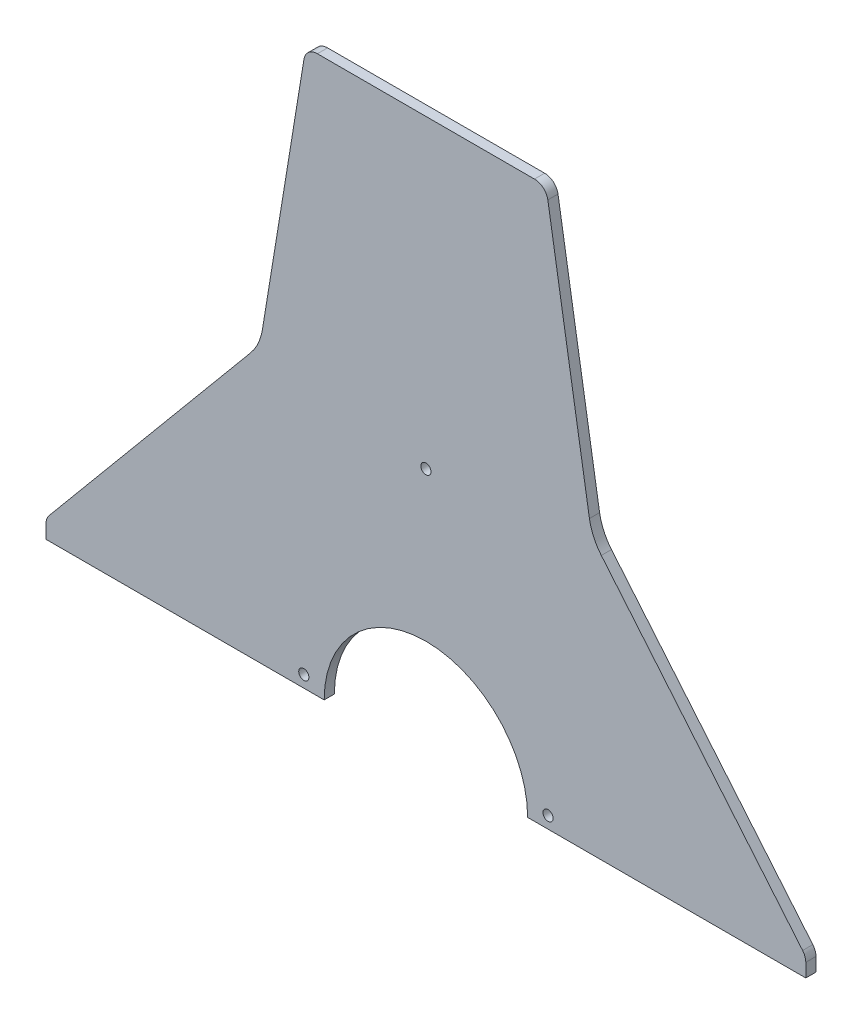
ISO-10303-21;
HEADER;
FILE_DESCRIPTION(('STEP AP214'),'2;1');
FILE_NAME('part.step','',(''),(''),'','','');
FILE_SCHEMA(('AUTOMOTIVE_DESIGN { 1 0 10303 214 1 1 1 1 }'));
ENDSEC;
DATA;
#1=APPLICATION_CONTEXT('core data for automotive mechanical design processes');
#2=APPLICATION_PROTOCOL_DEFINITION('international standard','automotive_design',2000,#1);
#3=PRODUCT_CONTEXT('',#1,'mechanical');
#4=PRODUCT('Part','Part','',(#3));
#5=PRODUCT_RELATED_PRODUCT_CATEGORY('part','',(#4));
#6=PRODUCT_DEFINITION_FORMATION('','',#4);
#7=PRODUCT_DEFINITION_CONTEXT('part definition',#1,'design');
#8=PRODUCT_DEFINITION('design','',#6,#7);
#9=PRODUCT_DEFINITION_SHAPE('','',#8);
#10=(LENGTH_UNIT() NAMED_UNIT(*) SI_UNIT(.MILLI.,.METRE.));
#11=(NAMED_UNIT(*) PLANE_ANGLE_UNIT() SI_UNIT($,.RADIAN.));
#12=(NAMED_UNIT(*) SI_UNIT($,.STERADIAN.) SOLID_ANGLE_UNIT());
#13=UNCERTAINTY_MEASURE_WITH_UNIT(LENGTH_MEASURE(1.E-05),#10,'distance_accuracy_value','');
#14=(GEOMETRIC_REPRESENTATION_CONTEXT(3) GLOBAL_UNCERTAINTY_ASSIGNED_CONTEXT((#13)) GLOBAL_UNIT_ASSIGNED_CONTEXT((#10,
#11,#12)) REPRESENTATION_CONTEXT('',''));
#15=CARTESIAN_POINT('',(0.,0.,0.));
#16=DIRECTION('',(0.,0.,1.));
#17=DIRECTION('',(1.,0.,0.));
#18=AXIS2_PLACEMENT_3D('',#15,#16,#17);
#19=CARTESIAN_POINT('',(355.6,139.7,139.7));
#20=DIRECTION('',(0.,1.,0.));
#21=DIRECTION('',(0.,0.,1.));
#22=AXIS2_PLACEMENT_3D('',#19,#20,#21);
#23=PLANE('',#22);
#24=DIRECTION('',(1.,0.,0.));
#25=VECTOR('',#24,1.);
#26=CARTESIAN_POINT('',(355.6,139.7,130.175));
#27=LINE('',#26,#25);
#28=CARTESIAN_POINT('',(95.25,139.7,130.175));
#29=VERTEX_POINT('',#28);
#30=CARTESIAN_POINT('',(355.6,139.7,130.175));
#31=VERTEX_POINT('',#30);
#32=EDGE_CURVE('E148',#29,#31,#27,.T.);
#33=ORIENTED_EDGE('',*,*,#32,.T.);
#34=DIRECTION('',(0.,0.,-1.));
#35=VECTOR('',#34,1.);
#36=CARTESIAN_POINT('',(355.6,139.7,139.7));
#37=LINE('',#36,#35);
#38=CARTESIAN_POINT('',(355.6,139.7,139.7));
#39=VERTEX_POINT('',#38);
#40=EDGE_CURVE('E11',#39,#31,#37,.T.);
#41=ORIENTED_EDGE('',*,*,#40,.F.);
#42=DIRECTION('',(1.,0.,0.));
#43=VECTOR('',#42,1.);
#44=CARTESIAN_POINT('',(355.6,139.7,139.7));
#45=LINE('',#44,#43);
#46=CARTESIAN_POINT('',(95.25,139.7,139.7));
#47=VERTEX_POINT('',#46);
#48=EDGE_CURVE('E196',#47,#39,#45,.T.);
#49=ORIENTED_EDGE('',*,*,#48,.F.);
#50=DIRECTION('',(0.,0.,-1.));
#51=VECTOR('',#50,1.);
#52=CARTESIAN_POINT('',(95.25,139.7,139.7));
#53=LINE('',#52,#51);
#54=EDGE_CURVE('E161',#47,#29,#53,.T.);
#55=ORIENTED_EDGE('',*,*,#54,.T.);
#56=EDGE_LOOP('',(#33,#41,#49,#55));
#57=FACE_BOUND('',#56,.T.);
#58=ADVANCED_FACE('F32',(#57),#23,.F.);
#59=CARTESIAN_POINT('',(355.6,152.4,139.7));
#60=DIRECTION('',(-1.,0.,0.));
#61=DIRECTION('',(0.,0.,1.));
#62=AXIS2_PLACEMENT_3D('',#59,#60,#61);
#63=PLANE('',#62);
#64=DIRECTION('',(0.,1.,0.));
#65=VECTOR('',#64,1.);
#66=CARTESIAN_POINT('',(355.6,152.4,130.175));
#67=LINE('',#66,#65);
#68=CARTESIAN_POINT('',(355.6,152.4,130.175));
#69=VERTEX_POINT('',#68);
#70=EDGE_CURVE('E144',#31,#69,#67,.T.);
#71=ORIENTED_EDGE('',*,*,#70,.T.);
#72=DIRECTION('',(0.,0.,-1.));
#73=VECTOR('',#72,1.);
#74=CARTESIAN_POINT('',(355.6,152.4,139.7));
#75=LINE('',#74,#73);
#76=CARTESIAN_POINT('',(355.6,152.4,139.7));
#77=VERTEX_POINT('',#76);
#78=EDGE_CURVE('E39',#77,#69,#75,.T.);
#79=ORIENTED_EDGE('',*,*,#78,.F.);
#80=DIRECTION('',(0.,1.,0.));
#81=VECTOR('',#80,1.);
#82=CARTESIAN_POINT('',(355.6,152.4,139.7));
#83=LINE('',#82,#81);
#84=EDGE_CURVE('E157',#39,#77,#83,.T.);
#85=ORIENTED_EDGE('',*,*,#84,.F.);
#86=ORIENTED_EDGE('',*,*,#40,.T.);
#87=EDGE_LOOP('',(#71,#79,#85,#86));
#88=FACE_BOUND('',#87,.T.);
#89=ADVANCED_FACE('F156',(#88),#63,.F.);
#90=CARTESIAN_POINT('',(342.9,152.4,139.7));
#91=DIRECTION('',(0.,0.,-1.));
#92=DIRECTION('',(-1.,0.,0.));
#93=AXIS2_PLACEMENT_3D('',#90,#91,#92);
#94=CYLINDRICAL_SURFACE('',#93,12.7);
#95=CARTESIAN_POINT('',(342.9,152.4,130.175));
#96=DIRECTION('',(0.,0.,1.));
#97=DIRECTION('',(1.,0.,0.));
#98=AXIS2_PLACEMENT_3D('',#95,#96,#97);
#99=CIRCLE('',#98,12.7);
#100=CARTESIAN_POINT('',(352.654107762785,160.533104066221,130.175));
#101=VERTEX_POINT('',#100);
#102=EDGE_CURVE('E150',#69,#101,#99,.T.);
#103=ORIENTED_EDGE('',*,*,#102,.T.);
#104=DIRECTION('',(0.,0.,-1.));
#105=VECTOR('',#104,1.);
#106=CARTESIAN_POINT('',(352.654107762785,160.533104066221,139.7));
#107=LINE('',#106,#105);
#108=CARTESIAN_POINT('',(352.654107762785,160.533104066221,139.7));
#109=VERTEX_POINT('',#108);
#110=EDGE_CURVE('E262',#109,#101,#107,.T.);
#111=ORIENTED_EDGE('',*,*,#110,.F.);
#112=CARTESIAN_POINT('',(342.9,152.4,139.7));
#113=DIRECTION('',(0.,0.,1.));
#114=DIRECTION('',(1.,0.,0.));
#115=AXIS2_PLACEMENT_3D('',#112,#113,#114);
#116=CIRCLE('',#115,12.7);
#117=EDGE_CURVE('E199',#77,#109,#116,.T.);
#118=ORIENTED_EDGE('',*,*,#117,.F.);
#119=ORIENTED_EDGE('',*,*,#78,.T.);
#120=EDGE_LOOP('',(#103,#111,#118,#119));
#121=FACE_BOUND('',#120,.T.);
#122=ADVANCED_FACE('F266',(#121),#94,.T.);
#123=CARTESIAN_POINT('',(164.18356894886,386.567583735117,139.7));
#124=DIRECTION('',(-0.768039981321658,-0.640401894978011,0.));
#125=DIRECTION('',(0.640401894978011,-0.768039981321658,0.));
#126=AXIS2_PLACEMENT_3D('',#123,#124,#125);
#127=PLANE('',#126);
#128=DIRECTION('',(-0.640401894978011,0.768039981321658,0.));
#129=VECTOR('',#128,1.);
#130=CARTESIAN_POINT('',(164.18356894886,386.567583735117,130.175));
#131=LINE('',#130,#129);
#132=CARTESIAN_POINT('',(164.18356894886,386.567583735117,130.175));
#133=VERTEX_POINT('',#132);
#134=EDGE_CURVE('E170',#101,#133,#131,.T.);
#135=ORIENTED_EDGE('',*,*,#134,.T.);
#136=DIRECTION('',(0.,0.,-1.));
#137=VECTOR('',#136,1.);
#138=CARTESIAN_POINT('',(164.18356894886,386.567583735117,139.7));
#139=LINE('',#138,#137);
#140=CARTESIAN_POINT('',(164.18356894886,386.567583735117,139.7));
#141=VERTEX_POINT('',#140);
#142=EDGE_CURVE('E259',#141,#133,#139,.T.);
#143=ORIENTED_EDGE('',*,*,#142,.F.);
#144=DIRECTION('',(-0.640401894978011,0.768039981321658,0.));
#145=VECTOR('',#144,1.);
#146=CARTESIAN_POINT('',(164.18356894886,386.567583735117,139.7));
#147=LINE('',#146,#145);
#148=EDGE_CURVE('E201',#109,#141,#147,.T.);
#149=ORIENTED_EDGE('',*,*,#148,.F.);
#150=ORIENTED_EDGE('',*,*,#110,.T.);
#151=EDGE_LOOP('',(#135,#143,#149,#150));
#152=FACE_BOUND('',#151,.T.);
#153=ADVANCED_FACE('F274',(#152),#127,.F.);
#154=CARTESIAN_POINT('',(203.2,419.1,139.7));
#155=DIRECTION('',(0.,0.,-1.));
#156=DIRECTION('',(-1.,0.,0.));
#157=AXIS2_PLACEMENT_3D('',#154,#155,#156);
#158=CYLINDRICAL_SURFACE('',#157,50.8);
#159=CARTESIAN_POINT('',(203.2,419.1,130.175));
#160=DIRECTION('',(0.,0.,-1.));
#161=DIRECTION('',(1.,0.,0.));
#162=AXIS2_PLACEMENT_3D('',#159,#160,#161);
#163=CIRCLE('',#162,50.8);
#164=CARTESIAN_POINT('',(153.061701435952,410.927422860423,130.175));
#165=VERTEX_POINT('',#164);
#166=EDGE_CURVE('E172',#133,#165,#163,.T.);
#167=ORIENTED_EDGE('',*,*,#166,.T.);
#168=DIRECTION('',(0.,0.,-1.));
#169=VECTOR('',#168,1.);
#170=CARTESIAN_POINT('',(153.061701435952,410.927422860423,139.7));
#171=LINE('',#170,#169);
#172=CARTESIAN_POINT('',(153.061701435952,410.927422860423,139.7));
#173=VERTEX_POINT('',#172);
#174=EDGE_CURVE('E256',#173,#165,#171,.T.);
#175=ORIENTED_EDGE('',*,*,#174,.F.);
#176=CARTESIAN_POINT('',(203.2,419.1,139.7));
#177=DIRECTION('',(0.,0.,-1.));
#178=DIRECTION('',(1.,0.,0.));
#179=AXIS2_PLACEMENT_3D('',#176,#177,#178);
#180=CIRCLE('',#179,50.8);
#181=EDGE_CURVE('E203',#141,#173,#180,.T.);
#182=ORIENTED_EDGE('',*,*,#181,.F.);
#183=ORIENTED_EDGE('',*,*,#142,.T.);
#184=EDGE_LOOP('',(#167,#175,#182,#183));
#185=FACE_BOUND('',#184,.T.);
#186=ADVANCED_FACE('F277',(#185),#158,.F.);
#187=CARTESIAN_POINT('',(114.134574641012,649.743144284894,139.7));
#188=DIRECTION('',(-0.986974381182056,-0.16087750274758,0.));
#189=DIRECTION('',(0.16087750274758,-0.986974381182056,0.));
#190=AXIS2_PLACEMENT_3D('',#187,#188,#189);
#191=PLANE('',#190);
#192=DIRECTION('',(-0.16087750274758,0.986974381182056,0.));
#193=VECTOR('',#192,1.);
#194=CARTESIAN_POINT('',(114.134574641012,649.743144284894,130.175));
#195=LINE('',#194,#193);
#196=CARTESIAN_POINT('',(114.134574641012,649.743144284894,130.175));
#197=VERTEX_POINT('',#196);
#198=EDGE_CURVE('E174',#165,#197,#195,.T.);
#199=ORIENTED_EDGE('',*,*,#198,.T.);
#200=DIRECTION('',(0.,0.,-1.));
#201=VECTOR('',#200,1.);
#202=CARTESIAN_POINT('',(114.134574641012,649.743144284894,139.7));
#203=LINE('',#202,#201);
#204=CARTESIAN_POINT('',(114.134574641012,649.743144284894,139.7));
#205=VERTEX_POINT('',#204);
#206=EDGE_CURVE('E253',#205,#197,#203,.T.);
#207=ORIENTED_EDGE('',*,*,#206,.F.);
#208=DIRECTION('',(-0.16087750274758,0.986974381182056,0.));
#209=VECTOR('',#208,1.);
#210=CARTESIAN_POINT('',(114.134574641012,649.743144284894,139.7));
#211=LINE('',#210,#209);
#212=EDGE_CURVE('E205',#173,#205,#211,.T.);
#213=ORIENTED_EDGE('',*,*,#212,.F.);
#214=ORIENTED_EDGE('',*,*,#174,.T.);
#215=EDGE_LOOP('',(#199,#207,#213,#214));
#216=FACE_BOUND('',#215,.T.);
#217=ADVANCED_FACE('F282',(#216),#191,.F.);
#218=CARTESIAN_POINT('',(101.6,647.7,139.7));
#219=DIRECTION('',(0.,0.,-1.));
#220=DIRECTION('',(-1.,0.,0.));
#221=AXIS2_PLACEMENT_3D('',#218,#219,#220);
#222=CYLINDRICAL_SURFACE('',#221,12.7);
#223=CARTESIAN_POINT('',(101.6,647.7,130.175));
#224=DIRECTION('',(0.,0.,1.));
#225=DIRECTION('',(-1.,0.,0.));
#226=AXIS2_PLACEMENT_3D('',#223,#224,#225);
#227=CIRCLE('',#226,12.7);
#228=CARTESIAN_POINT('',(101.6,660.4,130.175));
#229=VERTEX_POINT('',#228);
#230=EDGE_CURVE('E176',#197,#229,#227,.T.);
#231=ORIENTED_EDGE('',*,*,#230,.T.);
#232=DIRECTION('',(0.,0.,-1.));
#233=VECTOR('',#232,1.);
#234=CARTESIAN_POINT('',(101.6,660.4,139.7));
#235=LINE('',#234,#233);
#236=CARTESIAN_POINT('',(101.6,660.4,139.7));
#237=VERTEX_POINT('',#236);
#238=EDGE_CURVE('E250',#237,#229,#235,.T.);
#239=ORIENTED_EDGE('',*,*,#238,.F.);
#240=CARTESIAN_POINT('',(101.6,647.7,139.7));
#241=DIRECTION('',(0.,0.,1.));
#242=DIRECTION('',(-1.,0.,0.));
#243=AXIS2_PLACEMENT_3D('',#240,#241,#242);
#244=CIRCLE('',#243,12.7);
#245=EDGE_CURVE('E207',#205,#237,#244,.T.);
#246=ORIENTED_EDGE('',*,*,#245,.F.);
#247=ORIENTED_EDGE('',*,*,#206,.T.);
#248=EDGE_LOOP('',(#231,#239,#246,#247));
#249=FACE_BOUND('',#248,.T.);
#250=ADVANCED_FACE('F288',(#249),#222,.T.);
#251=CARTESIAN_POINT('',(101.6,660.4,139.7));
#252=DIRECTION('',(0.,-1.,0.));
#253=DIRECTION('',(0.,0.,-1.));
#254=AXIS2_PLACEMENT_3D('',#251,#252,#253);
#255=PLANE('',#254);
#256=DIRECTION('',(-1.,0.,0.));
#257=VECTOR('',#256,1.);
#258=CARTESIAN_POINT('',(101.6,660.4,130.175));
#259=LINE('',#258,#257);
#260=CARTESIAN_POINT('',(-101.6,660.4,130.175));
#261=VERTEX_POINT('',#260);
#262=EDGE_CURVE('E178',#229,#261,#259,.T.);
#263=ORIENTED_EDGE('',*,*,#262,.T.);
#264=DIRECTION('',(0.,0.,-1.));
#265=VECTOR('',#264,1.);
#266=CARTESIAN_POINT('',(-101.6,660.4,139.7));
#267=LINE('',#266,#265);
#268=CARTESIAN_POINT('',(-101.6,660.4,139.7));
#269=VERTEX_POINT('',#268);
#270=EDGE_CURVE('E247',#269,#261,#267,.T.);
#271=ORIENTED_EDGE('',*,*,#270,.F.);
#272=DIRECTION('',(-1.,0.,0.));
#273=VECTOR('',#272,1.);
#274=CARTESIAN_POINT('',(101.6,660.4,139.7));
#275=LINE('',#274,#273);
#276=EDGE_CURVE('E209',#237,#269,#275,.T.);
#277=ORIENTED_EDGE('',*,*,#276,.F.);
#278=ORIENTED_EDGE('',*,*,#238,.T.);
#279=EDGE_LOOP('',(#263,#271,#277,#278));
#280=FACE_BOUND('',#279,.T.);
#281=ADVANCED_FACE('F292',(#280),#255,.F.);
#282=CARTESIAN_POINT('',(-101.6,647.7,139.7));
#283=DIRECTION('',(0.,0.,-1.));
#284=DIRECTION('',(-1.,0.,0.));
#285=AXIS2_PLACEMENT_3D('',#282,#283,#284);
#286=CYLINDRICAL_SURFACE('',#285,12.7);
#287=CARTESIAN_POINT('',(-101.6,647.7,130.175));
#288=DIRECTION('',(0.,0.,1.));
#289=DIRECTION('',(-1.,0.,0.));
#290=AXIS2_PLACEMENT_3D('',#287,#288,#289);
#291=CIRCLE('',#290,12.7);
#292=CARTESIAN_POINT('',(-114.134574641012,649.743144284894,130.175));
#293=VERTEX_POINT('',#292);
#294=EDGE_CURVE('E180',#261,#293,#291,.T.);
#295=ORIENTED_EDGE('',*,*,#294,.T.);
#296=DIRECTION('',(0.,0.,-1.));
#297=VECTOR('',#296,1.);
#298=CARTESIAN_POINT('',(-114.134574641012,649.743144284894,139.7));
#299=LINE('',#298,#297);
#300=CARTESIAN_POINT('',(-114.134574641012,649.743144284894,139.7));
#301=VERTEX_POINT('',#300);
#302=EDGE_CURVE('E244',#301,#293,#299,.T.);
#303=ORIENTED_EDGE('',*,*,#302,.F.);
#304=CARTESIAN_POINT('',(-101.6,647.7,139.7));
#305=DIRECTION('',(0.,0.,1.));
#306=DIRECTION('',(-1.,0.,0.));
#307=AXIS2_PLACEMENT_3D('',#304,#305,#306);
#308=CIRCLE('',#307,12.7);
#309=EDGE_CURVE('E211',#269,#301,#308,.T.);
#310=ORIENTED_EDGE('',*,*,#309,.F.);
#311=ORIENTED_EDGE('',*,*,#270,.T.);
#312=EDGE_LOOP('',(#295,#303,#310,#311));
#313=FACE_BOUND('',#312,.T.);
#314=ADVANCED_FACE('F297',(#313),#286,.T.);
#315=CARTESIAN_POINT('',(-114.134574641012,649.743144284894,139.7));
#316=DIRECTION('',(0.986974381182056,-0.16087750274758,0.));
#317=DIRECTION('',(0.16087750274758,0.986974381182056,0.));
#318=AXIS2_PLACEMENT_3D('',#315,#316,#317);
#319=PLANE('',#318);
#320=DIRECTION('',(-0.16087750274758,-0.986974381182056,0.));
#321=VECTOR('',#320,1.);
#322=CARTESIAN_POINT('',(-114.134574641012,649.743144284894,130.175));
#323=LINE('',#322,#321);
#324=CARTESIAN_POINT('',(-153.061701435952,410.927422860423,130.175));
#325=VERTEX_POINT('',#324);
#326=EDGE_CURVE('E182',#293,#325,#323,.T.);
#327=ORIENTED_EDGE('',*,*,#326,.T.);
#328=DIRECTION('',(0.,0.,-1.));
#329=VECTOR('',#328,1.);
#330=CARTESIAN_POINT('',(-153.061701435952,410.927422860423,139.7));
#331=LINE('',#330,#329);
#332=CARTESIAN_POINT('',(-153.061701435952,410.927422860423,139.7));
#333=VERTEX_POINT('',#332);
#334=EDGE_CURVE('E241',#333,#325,#331,.T.);
#335=ORIENTED_EDGE('',*,*,#334,.F.);
#336=DIRECTION('',(-0.16087750274758,-0.986974381182056,0.));
#337=VECTOR('',#336,1.);
#338=CARTESIAN_POINT('',(-114.134574641012,649.743144284894,139.7));
#339=LINE('',#338,#337);
#340=EDGE_CURVE('E213',#301,#333,#339,.T.);
#341=ORIENTED_EDGE('',*,*,#340,.F.);
#342=ORIENTED_EDGE('',*,*,#302,.T.);
#343=EDGE_LOOP('',(#327,#335,#341,#342));
#344=FACE_BOUND('',#343,.T.);
#345=ADVANCED_FACE('F303',(#344),#319,.F.);
#346=CARTESIAN_POINT('',(-203.2,419.1,139.7));
#347=DIRECTION('',(0.,0.,-1.));
#348=DIRECTION('',(-1.,0.,0.));
#349=AXIS2_PLACEMENT_3D('',#346,#347,#348);
#350=CYLINDRICAL_SURFACE('',#349,50.8);
#351=CARTESIAN_POINT('',(-203.2,419.1,130.175));
#352=DIRECTION('',(0.,0.,-1.));
#353=DIRECTION('',(-1.,0.,0.));
#354=AXIS2_PLACEMENT_3D('',#351,#352,#353);
#355=CIRCLE('',#354,50.8);
#356=CARTESIAN_POINT('',(-164.18356894886,386.567583735117,130.175));
#357=VERTEX_POINT('',#356);
#358=EDGE_CURVE('E184',#325,#357,#355,.T.);
#359=ORIENTED_EDGE('',*,*,#358,.T.);
#360=DIRECTION('',(0.,0.,-1.));
#361=VECTOR('',#360,1.);
#362=CARTESIAN_POINT('',(-164.18356894886,386.567583735117,139.7));
#363=LINE('',#362,#361);
#364=CARTESIAN_POINT('',(-164.18356894886,386.567583735117,139.7));
#365=VERTEX_POINT('',#364);
#366=EDGE_CURVE('E238',#365,#357,#363,.T.);
#367=ORIENTED_EDGE('',*,*,#366,.F.);
#368=CARTESIAN_POINT('',(-203.2,419.1,139.7));
#369=DIRECTION('',(0.,0.,-1.));
#370=DIRECTION('',(-1.,0.,0.));
#371=AXIS2_PLACEMENT_3D('',#368,#369,#370);
#372=CIRCLE('',#371,50.8);
#373=EDGE_CURVE('E215',#333,#365,#372,.T.);
#374=ORIENTED_EDGE('',*,*,#373,.F.);
#375=ORIENTED_EDGE('',*,*,#334,.T.);
#376=EDGE_LOOP('',(#359,#367,#374,#375));
#377=FACE_BOUND('',#376,.T.);
#378=ADVANCED_FACE('F307',(#377),#350,.F.);
#379=CARTESIAN_POINT('',(-164.18356894886,386.567583735117,139.7));
#380=DIRECTION('',(0.768039981321658,-0.640401894978011,0.));
#381=DIRECTION('',(0.640401894978011,0.768039981321658,0.));
#382=AXIS2_PLACEMENT_3D('',#379,#380,#381);
#383=PLANE('',#382);
#384=DIRECTION('',(-0.640401894978011,-0.768039981321658,0.));
#385=VECTOR('',#384,1.);
#386=CARTESIAN_POINT('',(-164.18356894886,386.567583735117,130.175));
#387=LINE('',#386,#385);
#388=CARTESIAN_POINT('',(-352.654107762785,160.533104066221,130.175));
#389=VERTEX_POINT('',#388);
#390=EDGE_CURVE('E186',#357,#389,#387,.T.);
#391=ORIENTED_EDGE('',*,*,#390,.T.);
#392=DIRECTION('',(0.,0.,-1.));
#393=VECTOR('',#392,1.);
#394=CARTESIAN_POINT('',(-352.654107762785,160.533104066221,139.7));
#395=LINE('',#394,#393);
#396=CARTESIAN_POINT('',(-352.654107762785,160.533104066221,139.7));
#397=VERTEX_POINT('',#396);
#398=EDGE_CURVE('E235',#397,#389,#395,.T.);
#399=ORIENTED_EDGE('',*,*,#398,.F.);
#400=DIRECTION('',(-0.640401894978011,-0.768039981321658,0.));
#401=VECTOR('',#400,1.);
#402=CARTESIAN_POINT('',(-164.18356894886,386.567583735117,139.7));
#403=LINE('',#402,#401);
#404=EDGE_CURVE('E217',#365,#397,#403,.T.);
#405=ORIENTED_EDGE('',*,*,#404,.F.);
#406=ORIENTED_EDGE('',*,*,#366,.T.);
#407=EDGE_LOOP('',(#391,#399,#405,#406));
#408=FACE_BOUND('',#407,.T.);
#409=ADVANCED_FACE('F312',(#408),#383,.F.);
#410=CARTESIAN_POINT('',(-342.9,152.4,139.7));
#411=DIRECTION('',(0.,0.,-1.));
#412=DIRECTION('',(-1.,0.,0.));
#413=AXIS2_PLACEMENT_3D('',#410,#411,#412);
#414=CYLINDRICAL_SURFACE('',#413,12.7);
#415=CARTESIAN_POINT('',(-342.9,152.4,130.175));
#416=DIRECTION('',(0.,0.,1.));
#417=DIRECTION('',(-1.,0.,0.));
#418=AXIS2_PLACEMENT_3D('',#415,#416,#417);
#419=CIRCLE('',#418,12.7);
#420=CARTESIAN_POINT('',(-355.6,152.4,130.175));
#421=VERTEX_POINT('',#420);
#422=EDGE_CURVE('E188',#389,#421,#419,.T.);
#423=ORIENTED_EDGE('',*,*,#422,.T.);
#424=DIRECTION('',(0.,0.,-1.));
#425=VECTOR('',#424,1.);
#426=CARTESIAN_POINT('',(-355.6,152.4,139.7));
#427=LINE('',#426,#425);
#428=CARTESIAN_POINT('',(-355.6,152.4,139.7));
#429=VERTEX_POINT('',#428);
#430=EDGE_CURVE('E232',#429,#421,#427,.T.);
#431=ORIENTED_EDGE('',*,*,#430,.F.);
#432=CARTESIAN_POINT('',(-342.9,152.4,139.7));
#433=DIRECTION('',(0.,0.,1.));
#434=DIRECTION('',(-1.,0.,0.));
#435=AXIS2_PLACEMENT_3D('',#432,#433,#434);
#436=CIRCLE('',#435,12.7);
#437=EDGE_CURVE('E219',#397,#429,#436,.T.);
#438=ORIENTED_EDGE('',*,*,#437,.F.);
#439=ORIENTED_EDGE('',*,*,#398,.T.);
#440=EDGE_LOOP('',(#423,#431,#438,#439));
#441=FACE_BOUND('',#440,.T.);
#442=ADVANCED_FACE('F318',(#441),#414,.T.);
#443=CARTESIAN_POINT('',(-355.6,152.4,139.7));
#444=DIRECTION('',(1.,0.,0.));
#445=DIRECTION('',(0.,0.,-1.));
#446=AXIS2_PLACEMENT_3D('',#443,#444,#445);
#447=PLANE('',#446);
#448=DIRECTION('',(0.,-1.,0.));
#449=VECTOR('',#448,1.);
#450=CARTESIAN_POINT('',(-355.6,152.4,130.175));
#451=LINE('',#450,#449);
#452=CARTESIAN_POINT('',(-355.6,139.7,130.175));
#453=VERTEX_POINT('',#452);
#454=EDGE_CURVE('E190',#421,#453,#451,.T.);
#455=ORIENTED_EDGE('',*,*,#454,.T.);
#456=DIRECTION('',(0.,0.,-1.));
#457=VECTOR('',#456,1.);
#458=CARTESIAN_POINT('',(-355.6,139.7,139.7));
#459=LINE('',#458,#457);
#460=CARTESIAN_POINT('',(-355.6,139.7,139.7));
#461=VERTEX_POINT('',#460);
#462=EDGE_CURVE('E229',#461,#453,#459,.T.);
#463=ORIENTED_EDGE('',*,*,#462,.F.);
#464=DIRECTION('',(0.,-1.,0.));
#465=VECTOR('',#464,1.);
#466=CARTESIAN_POINT('',(-355.6,152.4,139.7));
#467=LINE('',#466,#465);
#468=EDGE_CURVE('E221',#429,#461,#467,.T.);
#469=ORIENTED_EDGE('',*,*,#468,.F.);
#470=ORIENTED_EDGE('',*,*,#430,.T.);
#471=EDGE_LOOP('',(#455,#463,#469,#470));
#472=FACE_BOUND('',#471,.T.);
#473=ADVANCED_FACE('F322',(#472),#447,.F.);
#474=CARTESIAN_POINT('',(-95.25,139.7,139.7));
#475=DIRECTION('',(0.,1.,0.));
#476=DIRECTION('',(-1.,0.,0.));
#477=AXIS2_PLACEMENT_3D('',#474,#475,#476);
#478=PLANE('',#477);
#479=DIRECTION('',(1.,0.,0.));
#480=VECTOR('',#479,1.);
#481=CARTESIAN_POINT('',(-95.25,139.7,130.175));
#482=LINE('',#481,#480);
#483=CARTESIAN_POINT('',(-95.25,139.7,130.175));
#484=VERTEX_POINT('',#483);
#485=EDGE_CURVE('E192',#453,#484,#482,.T.);
#486=ORIENTED_EDGE('',*,*,#485,.T.);
#487=DIRECTION('',(0.,0.,-1.));
#488=VECTOR('',#487,1.);
#489=CARTESIAN_POINT('',(-95.25,139.7,139.7));
#490=LINE('',#489,#488);
#491=CARTESIAN_POINT('',(-95.25,139.7,139.7));
#492=VERTEX_POINT('',#491);
#493=EDGE_CURVE('E226',#492,#484,#490,.T.);
#494=ORIENTED_EDGE('',*,*,#493,.F.);
#495=DIRECTION('',(1.,0.,0.));
#496=VECTOR('',#495,1.);
#497=CARTESIAN_POINT('',(-95.25,139.7,139.7));
#498=LINE('',#497,#496);
#499=EDGE_CURVE('E51',#461,#492,#498,.T.);
#500=ORIENTED_EDGE('',*,*,#499,.F.);
#501=ORIENTED_EDGE('',*,*,#462,.T.);
#502=EDGE_LOOP('',(#486,#494,#500,#501));
#503=FACE_BOUND('',#502,.T.);
#504=ADVANCED_FACE('F325',(#503),#478,.F.);
#505=CARTESIAN_POINT('',(0.,139.7,139.7));
#506=DIRECTION('',(0.,0.,-1.));
#507=DIRECTION('',(-1.,0.,0.));
#508=AXIS2_PLACEMENT_3D('',#505,#506,#507);
#509=CYLINDRICAL_SURFACE('',#508,95.25);
#510=CARTESIAN_POINT('',(0.,139.7,130.175));
#511=DIRECTION('',(0.,0.,-1.));
#512=DIRECTION('',(1.,0.,0.));
#513=AXIS2_PLACEMENT_3D('',#510,#511,#512);
#514=CIRCLE('',#513,95.25);
#515=EDGE_CURVE('E194',#484,#29,#514,.T.);
#516=ORIENTED_EDGE('',*,*,#515,.T.);
#517=ORIENTED_EDGE('',*,*,#54,.F.);
#518=CARTESIAN_POINT('',(0.,139.7,139.7));
#519=DIRECTION('',(0.,0.,-1.));
#520=DIRECTION('',(1.,0.,0.));
#521=AXIS2_PLACEMENT_3D('',#518,#519,#520);
#522=CIRCLE('',#521,95.25);
#523=EDGE_CURVE('E46',#492,#47,#522,.T.);
#524=ORIENTED_EDGE('',*,*,#523,.F.);
#525=ORIENTED_EDGE('',*,*,#493,.T.);
#526=EDGE_LOOP('',(#516,#517,#524,#525));
#527=FACE_BOUND('',#526,.T.);
#528=ADVANCED_FACE('F327',(#527),#509,.F.);
#529=CARTESIAN_POINT('',(0.,139.7,139.7));
#530=DIRECTION('',(0.,0.,1.));
#531=DIRECTION('',(1.,0.,0.));
#532=AXIS2_PLACEMENT_3D('',#529,#530,#531);
#533=PLANE('',#532);
#534=CARTESIAN_POINT('',(-114.3,150.8252,139.7));
#535=DIRECTION('',(0.,0.,1.));
#536=DIRECTION('',(-1.,0.,0.));
#537=AXIS2_PLACEMENT_3D('',#534,#535,#536);
#538=CIRCLE('',#537,4.7625);
#539=CARTESIAN_POINT('',(-119.0625,150.8252,139.7));
#540=VERTEX_POINT('',#539);
#541=EDGE_CURVE('E434',#540,#540,#538,.T.);
#542=ORIENTED_EDGE('',*,*,#541,.F.);
#543=EDGE_LOOP('',(#542));
#544=FACE_BOUND('',#543,.T.);
#545=CARTESIAN_POINT('',(114.3,150.8252,139.7));
#546=DIRECTION('',(0.,0.,1.));
#547=DIRECTION('',(1.,0.,0.));
#548=AXIS2_PLACEMENT_3D('',#545,#546,#547);
#549=CIRCLE('',#548,4.7625);
#550=CARTESIAN_POINT('',(119.0625,150.8252,139.7));
#551=VERTEX_POINT('',#550);
#552=EDGE_CURVE('E436',#551,#551,#549,.T.);
#553=ORIENTED_EDGE('',*,*,#552,.F.);
#554=EDGE_LOOP('',(#553));
#555=FACE_BOUND('',#554,.T.);
#556=CARTESIAN_POINT('',(0.,374.65,139.7));
#557=DIRECTION('',(0.,0.,1.));
#558=DIRECTION('',(1.,0.,0.));
#559=AXIS2_PLACEMENT_3D('',#556,#557,#558);
#560=CIRCLE('',#559,4.7625);
#561=CARTESIAN_POINT('',(4.7625,374.65,139.7));
#562=VERTEX_POINT('',#561);
#563=EDGE_CURVE('E165',#562,#562,#560,.T.);
#564=ORIENTED_EDGE('',*,*,#563,.F.);
#565=EDGE_LOOP('',(#564));
#566=FACE_BOUND('',#565,.T.);
#567=ORIENTED_EDGE('',*,*,#48,.T.);
#568=ORIENTED_EDGE('',*,*,#84,.T.);
#569=ORIENTED_EDGE('',*,*,#117,.T.);
#570=ORIENTED_EDGE('',*,*,#148,.T.);
#571=ORIENTED_EDGE('',*,*,#181,.T.);
#572=ORIENTED_EDGE('',*,*,#212,.T.);
#573=ORIENTED_EDGE('',*,*,#245,.T.);
#574=ORIENTED_EDGE('',*,*,#276,.T.);
#575=ORIENTED_EDGE('',*,*,#309,.T.);
#576=ORIENTED_EDGE('',*,*,#340,.T.);
#577=ORIENTED_EDGE('',*,*,#373,.T.);
#578=ORIENTED_EDGE('',*,*,#404,.T.);
#579=ORIENTED_EDGE('',*,*,#437,.T.);
#580=ORIENTED_EDGE('',*,*,#468,.T.);
#581=ORIENTED_EDGE('',*,*,#499,.T.);
#582=ORIENTED_EDGE('',*,*,#523,.T.);
#583=EDGE_LOOP('',(#567,#568,#569,#570,#571,#572,#573,#574,#575,#576,#577,#578,#579,#580,#581,#582));
#584=FACE_BOUND('',#583,.T.);
#585=ADVANCED_FACE('F269',(#544,#555,#566,#584),#533,.T.);
#586=CARTESIAN_POINT('',(0.,139.7,130.175));
#587=DIRECTION('',(0.,0.,1.));
#588=DIRECTION('',(1.,0.,0.));
#589=AXIS2_PLACEMENT_3D('',#586,#587,#588);
#590=PLANE('',#589);
#591=CARTESIAN_POINT('',(-114.3,150.8252,130.175));
#592=DIRECTION('',(0.,0.,1.));
#593=DIRECTION('',(-1.,0.,0.));
#594=AXIS2_PLACEMENT_3D('',#591,#592,#593);
#595=CIRCLE('',#594,4.7625);
#596=CARTESIAN_POINT('',(-119.0625,150.8252,130.175));
#597=VERTEX_POINT('',#596);
#598=EDGE_CURVE('E431',#597,#597,#595,.T.);
#599=ORIENTED_EDGE('',*,*,#598,.T.);
#600=EDGE_LOOP('',(#599));
#601=FACE_BOUND('',#600,.T.);
#602=CARTESIAN_POINT('',(114.3,150.8252,130.175));
#603=DIRECTION('',(0.,0.,1.));
#604=DIRECTION('',(1.,0.,0.));
#605=AXIS2_PLACEMENT_3D('',#602,#603,#604);
#606=CIRCLE('',#605,4.7625);
#607=CARTESIAN_POINT('',(119.0625,150.8252,130.175));
#608=VERTEX_POINT('',#607);
#609=EDGE_CURVE('E441',#608,#608,#606,.T.);
#610=ORIENTED_EDGE('',*,*,#609,.T.);
#611=EDGE_LOOP('',(#610));
#612=FACE_BOUND('',#611,.T.);
#613=CARTESIAN_POINT('',(0.,374.65,130.175));
#614=DIRECTION('',(0.,0.,1.));
#615=DIRECTION('',(1.,0.,0.));
#616=AXIS2_PLACEMENT_3D('',#613,#614,#615);
#617=CIRCLE('',#616,4.7625);
#618=CARTESIAN_POINT('',(4.7625,374.65,130.175));
#619=VERTEX_POINT('',#618);
#620=EDGE_CURVE('E162',#619,#619,#617,.T.);
#621=ORIENTED_EDGE('',*,*,#620,.T.);
#622=EDGE_LOOP('',(#621));
#623=FACE_BOUND('',#622,.T.);
#624=ORIENTED_EDGE('',*,*,#32,.F.);
#625=ORIENTED_EDGE('',*,*,#515,.F.);
#626=ORIENTED_EDGE('',*,*,#485,.F.);
#627=ORIENTED_EDGE('',*,*,#454,.F.);
#628=ORIENTED_EDGE('',*,*,#422,.F.);
#629=ORIENTED_EDGE('',*,*,#390,.F.);
#630=ORIENTED_EDGE('',*,*,#358,.F.);
#631=ORIENTED_EDGE('',*,*,#326,.F.);
#632=ORIENTED_EDGE('',*,*,#294,.F.);
#633=ORIENTED_EDGE('',*,*,#262,.F.);
#634=ORIENTED_EDGE('',*,*,#230,.F.);
#635=ORIENTED_EDGE('',*,*,#198,.F.);
#636=ORIENTED_EDGE('',*,*,#166,.F.);
#637=ORIENTED_EDGE('',*,*,#134,.F.);
#638=ORIENTED_EDGE('',*,*,#102,.F.);
#639=ORIENTED_EDGE('',*,*,#70,.F.);
#640=EDGE_LOOP('',(#624,#625,#626,#627,#628,#629,#630,#631,#632,#633,#634,#635,#636,#637,#638,#639));
#641=FACE_BOUND('',#640,.T.);
#642=ADVANCED_FACE('F145',(#601,#612,#623,#641),#590,.F.);
#643=CARTESIAN_POINT('',(0.,374.65,130.175));
#644=DIRECTION('',(0.,0.,1.));
#645=DIRECTION('',(1.,0.,0.));
#646=AXIS2_PLACEMENT_3D('',#643,#644,#645);
#647=CYLINDRICAL_SURFACE('',#646,4.7625);
#648=ORIENTED_EDGE('',*,*,#620,.F.);
#649=EDGE_LOOP('',(#648));
#650=FACE_BOUND('',#649,.T.);
#651=ORIENTED_EDGE('',*,*,#563,.T.);
#652=EDGE_LOOP('',(#651));
#653=FACE_BOUND('',#652,.T.);
#654=ADVANCED_FACE('F394',(#650,#653),#647,.F.);
#655=CARTESIAN_POINT('',(114.3,150.8252,130.175));
#656=DIRECTION('',(0.,0.,1.));
#657=DIRECTION('',(1.,0.,0.));
#658=AXIS2_PLACEMENT_3D('',#655,#656,#657);
#659=CYLINDRICAL_SURFACE('',#658,4.7625);
#660=ORIENTED_EDGE('',*,*,#609,.F.);
#661=EDGE_LOOP('',(#660));
#662=FACE_BOUND('',#661,.T.);
#663=ORIENTED_EDGE('',*,*,#552,.T.);
#664=EDGE_LOOP('',(#663));
#665=FACE_BOUND('',#664,.T.);
#666=ADVANCED_FACE('F404',(#662,#665),#659,.F.);
#667=CARTESIAN_POINT('',(-114.3,150.8252,130.175));
#668=DIRECTION('',(0.,0.,1.));
#669=DIRECTION('',(1.,0.,0.));
#670=AXIS2_PLACEMENT_3D('',#667,#668,#669);
#671=CYLINDRICAL_SURFACE('',#670,4.7625);
#672=ORIENTED_EDGE('',*,*,#598,.F.);
#673=EDGE_LOOP('',(#672));
#674=FACE_BOUND('',#673,.T.);
#675=ORIENTED_EDGE('',*,*,#541,.T.);
#676=EDGE_LOOP('',(#675));
#677=FACE_BOUND('',#676,.T.);
#678=ADVANCED_FACE('F414',(#674,#677),#671,.F.);
#679=CLOSED_SHELL('',(#58,#89,#122,#153,#186,#217,#250,#281,#314,#345,#378,#409,#442,#473,#504,
#528,#585,#642,#654,#666,#678));
#680=MANIFOLD_SOLID_BREP('B2',#679);
#681=ADVANCED_BREP_SHAPE_REPRESENTATION('',(#18,#680),#14);
#682=SHAPE_DEFINITION_REPRESENTATION(#9,#681);
ENDSEC;
END-ISO-10303-21;
